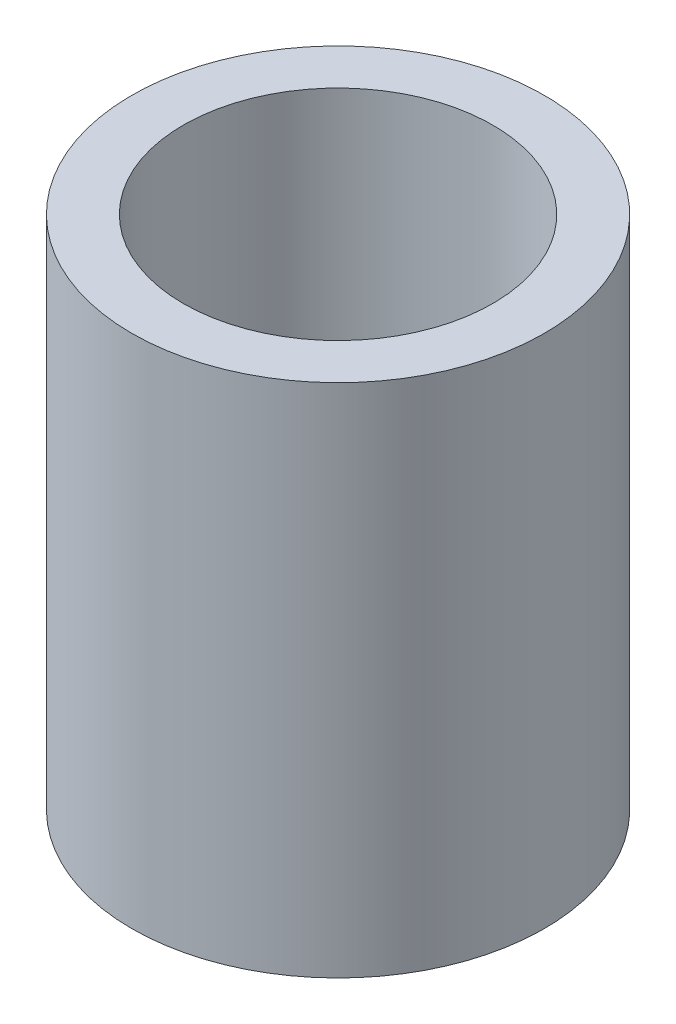
ISO-10303-21;
HEADER;
FILE_DESCRIPTION(('STEP AP214'),'2;1');
FILE_NAME('part.step','',(''),(''),'','','');
FILE_SCHEMA(('AUTOMOTIVE_DESIGN { 1 0 10303 214 1 1 1 1 }'));
ENDSEC;
DATA;
#1=APPLICATION_CONTEXT('core data for automotive mechanical design processes');
#2=APPLICATION_PROTOCOL_DEFINITION('international standard','automotive_design',2000,#1);
#3=PRODUCT_CONTEXT('',#1,'mechanical');
#4=PRODUCT('Part','Part','',(#3));
#5=PRODUCT_RELATED_PRODUCT_CATEGORY('part','',(#4));
#6=PRODUCT_DEFINITION_FORMATION('','',#4);
#7=PRODUCT_DEFINITION_CONTEXT('part definition',#1,'design');
#8=PRODUCT_DEFINITION('design','',#6,#7);
#9=PRODUCT_DEFINITION_SHAPE('','',#8);
#10=(LENGTH_UNIT() NAMED_UNIT(*) SI_UNIT(.MILLI.,.METRE.));
#11=(NAMED_UNIT(*) PLANE_ANGLE_UNIT() SI_UNIT($,.RADIAN.));
#12=(NAMED_UNIT(*) SI_UNIT($,.STERADIAN.) SOLID_ANGLE_UNIT());
#13=UNCERTAINTY_MEASURE_WITH_UNIT(LENGTH_MEASURE(1.E-05),#10,'distance_accuracy_value','');
#14=(GEOMETRIC_REPRESENTATION_CONTEXT(3) GLOBAL_UNCERTAINTY_ASSIGNED_CONTEXT((#13)) GLOBAL_UNIT_ASSIGNED_CONTEXT((#10,
#11,#12)) REPRESENTATION_CONTEXT('',''));
#15=CARTESIAN_POINT('',(0.,0.,0.));
#16=DIRECTION('',(0.,0.,1.));
#17=DIRECTION('',(1.,0.,0.));
#18=AXIS2_PLACEMENT_3D('',#15,#16,#17);
#19=CARTESIAN_POINT('',(0.,25.4,0.));
#20=DIRECTION('',(0.,-1.,0.));
#21=DIRECTION('',(0.,0.,-1.));
#22=AXIS2_PLACEMENT_3D('',#19,#20,#21);
#23=CYLINDRICAL_SURFACE('',#22,10.16);
#24=CARTESIAN_POINT('',(0.,25.4,0.));
#25=DIRECTION('',(0.,1.,0.));
#26=DIRECTION('',(0.,0.,1.));
#27=AXIS2_PLACEMENT_3D('',#24,#25,#26);
#28=CIRCLE('',#27,10.16);
#29=CARTESIAN_POINT('',(0.,25.4,10.16));
#30=VERTEX_POINT('',#29);
#31=EDGE_CURVE('E61',#30,#30,#28,.T.);
#32=ORIENTED_EDGE('',*,*,#31,.F.);
#33=EDGE_LOOP('',(#32));
#34=FACE_BOUND('',#33,.T.);
#35=CARTESIAN_POINT('',(0.,0.,0.));
#36=DIRECTION('',(0.,1.,0.));
#37=DIRECTION('',(0.,0.,1.));
#38=AXIS2_PLACEMENT_3D('',#35,#36,#37);
#39=CIRCLE('',#38,10.16);
#40=CARTESIAN_POINT('',(0.,0.,10.16));
#41=VERTEX_POINT('',#40);
#42=EDGE_CURVE('E62',#41,#41,#39,.T.);
#43=ORIENTED_EDGE('',*,*,#42,.T.);
#44=EDGE_LOOP('',(#43));
#45=FACE_BOUND('',#44,.T.);
#46=ADVANCED_FACE('F40',(#34,#45),#23,.T.);
#47=CARTESIAN_POINT('',(0.,25.4,0.));
#48=DIRECTION('',(0.,1.,0.));
#49=DIRECTION('',(0.,0.,1.));
#50=AXIS2_PLACEMENT_3D('',#47,#48,#49);
#51=PLANE('',#50);
#52=CARTESIAN_POINT('',(0.,25.4,0.));
#53=DIRECTION('',(0.,1.,0.));
#54=DIRECTION('',(0.,0.,1.));
#55=AXIS2_PLACEMENT_3D('',#52,#53,#54);
#56=CIRCLE('',#55,7.62);
#57=CARTESIAN_POINT('',(0.,25.4,7.62));
#58=VERTEX_POINT('',#57);
#59=EDGE_CURVE('E68',#58,#58,#56,.T.);
#60=ORIENTED_EDGE('',*,*,#59,.F.);
#61=EDGE_LOOP('',(#60));
#62=FACE_BOUND('',#61,.T.);
#63=ORIENTED_EDGE('',*,*,#31,.T.);
#64=EDGE_LOOP('',(#63));
#65=FACE_BOUND('',#64,.T.);
#66=ADVANCED_FACE('F83',(#62,#65),#51,.T.);
#67=CARTESIAN_POINT('',(0.,0.,0.));
#68=DIRECTION('',(0.,1.,0.));
#69=DIRECTION('',(0.,0.,1.));
#70=AXIS2_PLACEMENT_3D('',#67,#68,#69);
#71=PLANE('',#70);
#72=CARTESIAN_POINT('',(0.,0.,0.));
#73=DIRECTION('',(0.,1.,0.));
#74=DIRECTION('',(0.,0.,1.));
#75=AXIS2_PLACEMENT_3D('',#72,#73,#74);
#76=CIRCLE('',#75,1.27000000000001);
#77=CARTESIAN_POINT('',(0.,0.,1.27000000000001));
#78=VERTEX_POINT('',#77);
#79=EDGE_CURVE('E52',#78,#78,#76,.T.);
#80=ORIENTED_EDGE('',*,*,#79,.T.);
#81=EDGE_LOOP('',(#80));
#82=FACE_BOUND('',#81,.T.);
#83=ORIENTED_EDGE('',*,*,#42,.F.);
#84=EDGE_LOOP('',(#83));
#85=FACE_BOUND('',#84,.T.);
#86=ADVANCED_FACE('F79',(#82,#85),#71,.F.);
#87=CARTESIAN_POINT('',(0.,5.08,0.));
#88=DIRECTION('',(0.,1.,0.));
#89=DIRECTION('',(0.,0.,1.));
#90=AXIS2_PLACEMENT_3D('',#87,#88,#89);
#91=CYLINDRICAL_SURFACE('',#90,7.62);
#92=CARTESIAN_POINT('',(0.,5.08,0.));
#93=DIRECTION('',(0.,1.,0.));
#94=DIRECTION('',(0.,0.,1.));
#95=AXIS2_PLACEMENT_3D('',#92,#93,#94);
#96=CIRCLE('',#95,7.62);
#97=CARTESIAN_POINT('',(0.,5.08,7.62));
#98=VERTEX_POINT('',#97);
#99=EDGE_CURVE('E65',#98,#98,#96,.T.);
#100=ORIENTED_EDGE('',*,*,#99,.F.);
#101=EDGE_LOOP('',(#100));
#102=FACE_BOUND('',#101,.T.);
#103=ORIENTED_EDGE('',*,*,#59,.T.);
#104=EDGE_LOOP('',(#103));
#105=FACE_BOUND('',#104,.T.);
#106=ADVANCED_FACE('F76',(#102,#105),#91,.F.);
#107=CARTESIAN_POINT('',(0.,5.08,0.));
#108=DIRECTION('',(0.,1.,0.));
#109=DIRECTION('',(0.,0.,1.));
#110=AXIS2_PLACEMENT_3D('',#107,#108,#109);
#111=PLANE('',#110);
#112=ORIENTED_EDGE('',*,*,#99,.T.);
#113=EDGE_LOOP('',(#112));
#114=FACE_BOUND('',#113,.T.);
#115=ADVANCED_FACE('F74',(#114),#111,.T.);
#116=CARTESIAN_POINT('',(0.,3.048,0.));
#117=DIRECTION('',(0.,-1.,0.));
#118=DIRECTION('',(0.,0.,-1.));
#119=AXIS2_PLACEMENT_3D('',#116,#117,#118);
#120=CYLINDRICAL_SURFACE('',#119,0.889);
#121=CARTESIAN_POINT('',(0.,2.8321,0.));
#122=DIRECTION('',(0.,-1.,0.));
#123=DIRECTION('',(0.,0.,-1.));
#124=AXIS2_PLACEMENT_3D('',#121,#122,#123);
#125=CIRCLE('',#124,0.889);
#126=CARTESIAN_POINT('',(0.,2.8321,-0.889));
#127=VERTEX_POINT('',#126);
#128=EDGE_CURVE('E10',#127,#127,#125,.F.);
#129=CARTESIAN_POINT('',(0.,0.381000000000014,0.));
#130=DIRECTION('',(0.,1.,0.));
#131=DIRECTION('',(0.,0.,1.));
#132=AXIS2_PLACEMENT_3D('',#129,#130,#131);
#133=CIRCLE('',#132,0.889);
#134=CARTESIAN_POINT('',(0.,0.381000000000013,-0.889));
#135=VERTEX_POINT('',#134);
#136=EDGE_CURVE('E56',#135,#135,#133,.F.);
#137=CARTESIAN_POINT('',(0.,2.8321,-0.889));
#138=CARTESIAN_POINT('',(0.,2.80656770833334,-0.889));
#139=CARTESIAN_POINT('',(0.,2.78103541666667,-0.889));
#140=CARTESIAN_POINT('',(0.,2.72997083333334,-0.889));
#141=CARTESIAN_POINT('',(0.,2.70443854166667,-0.889));
#142=CARTESIAN_POINT('',(0.,2.65337395833334,-0.889));
#143=CARTESIAN_POINT('',(0.,2.62784166666667,-0.889));
#144=CARTESIAN_POINT('',(0.,2.57677708333334,-0.889));
#145=CARTESIAN_POINT('',(0.,2.55124479166667,-0.889));
#146=CARTESIAN_POINT('',(0.,2.50018020833334,-0.889));
#147=CARTESIAN_POINT('',(0.,2.47464791666667,-0.889));
#148=CARTESIAN_POINT('',(0.,2.42358333333334,-0.889));
#149=CARTESIAN_POINT('',(0.,2.39805104166667,-0.889));
#150=CARTESIAN_POINT('',(0.,2.34698645833334,-0.889));
#151=CARTESIAN_POINT('',(0.,2.32145416666667,-0.889));
#152=CARTESIAN_POINT('',(0.,2.27038958333334,-0.889));
#153=CARTESIAN_POINT('',(0.,2.24485729166667,-0.889));
#154=CARTESIAN_POINT('',(0.,2.19379270833334,-0.889));
#155=CARTESIAN_POINT('',(0.,2.16826041666667,-0.889));
#156=CARTESIAN_POINT('',(0.,2.11719583333334,-0.889));
#157=CARTESIAN_POINT('',(0.,2.09166354166667,-0.889));
#158=CARTESIAN_POINT('',(0.,2.04059895833334,-0.889));
#159=CARTESIAN_POINT('',(0.,2.01506666666667,-0.889));
#160=CARTESIAN_POINT('',(0.,1.96400208333334,-0.889));
#161=CARTESIAN_POINT('',(0.,1.93846979166667,-0.889));
#162=CARTESIAN_POINT('',(0.,1.88740520833334,-0.889));
#163=CARTESIAN_POINT('',(0.,1.86187291666667,-0.889));
#164=CARTESIAN_POINT('',(0.,1.81080833333334,-0.889));
#165=CARTESIAN_POINT('',(0.,1.78527604166667,-0.889));
#166=CARTESIAN_POINT('',(0.,1.73421145833334,-0.889));
#167=CARTESIAN_POINT('',(0.,1.70867916666667,-0.889));
#168=CARTESIAN_POINT('',(0.,1.65761458333334,-0.889));
#169=CARTESIAN_POINT('',(0.,1.63208229166667,-0.889));
#170=CARTESIAN_POINT('',(0.,1.58101770833334,-0.889));
#171=CARTESIAN_POINT('',(0.,1.55548541666667,-0.889));
#172=CARTESIAN_POINT('',(0.,1.50442083333334,-0.889));
#173=CARTESIAN_POINT('',(0.,1.47888854166667,-0.889));
#174=CARTESIAN_POINT('',(0.,1.42782395833334,-0.889));
#175=CARTESIAN_POINT('',(0.,1.40229166666667,-0.889));
#176=CARTESIAN_POINT('',(0.,1.35122708333334,-0.889));
#177=CARTESIAN_POINT('',(0.,1.32569479166668,-0.889));
#178=CARTESIAN_POINT('',(0.,1.27463020833334,-0.889));
#179=CARTESIAN_POINT('',(0.,1.24909791666668,-0.889));
#180=CARTESIAN_POINT('',(0.,1.19803333333334,-0.889));
#181=CARTESIAN_POINT('',(0.,1.17250104166668,-0.889));
#182=CARTESIAN_POINT('',(0.,1.12143645833334,-0.889));
#183=CARTESIAN_POINT('',(0.,1.09590416666668,-0.889));
#184=CARTESIAN_POINT('',(0.,1.04483958333334,-0.889));
#185=CARTESIAN_POINT('',(0.,1.01930729166668,-0.889));
#186=CARTESIAN_POINT('',(0.,0.968242708333344,-0.889));
#187=CARTESIAN_POINT('',(0.,0.942710416666677,-0.889));
#188=CARTESIAN_POINT('',(0.,0.891645833333344,-0.889));
#189=CARTESIAN_POINT('',(0.,0.866113541666678,-0.889));
#190=CARTESIAN_POINT('',(0.,0.815048958333345,-0.889));
#191=CARTESIAN_POINT('',(0.,0.789516666666678,-0.889));
#192=CARTESIAN_POINT('',(0.,0.738452083333345,-0.889));
#193=CARTESIAN_POINT('',(0.,0.712919791666679,-0.889));
#194=CARTESIAN_POINT('',(0.,0.661855208333345,-0.889));
#195=CARTESIAN_POINT('',(0.,0.636322916666679,-0.889));
#196=CARTESIAN_POINT('',(0.,0.585258333333345,-0.889));
#197=CARTESIAN_POINT('',(0.,0.559726041666679,-0.889));
#198=CARTESIAN_POINT('',(0.,0.508661458333346,-0.889));
#199=CARTESIAN_POINT('',(0.,0.483129166666679,-0.889));
#200=CARTESIAN_POINT('',(0.,0.432064583333346,-0.889));
#201=CARTESIAN_POINT('',(0.,0.40653229166668,-0.889));
#202=CARTESIAN_POINT('',(0.,0.381000000000013,-0.889));
#203=B_SPLINE_CURVE_WITH_KNOTS('',3,(#137,#138,#139,#140,#141,#142,#143,#144,#145,#146,#147,
#148,#149,#150,#151,#152,#153,#154,#155,#156,#157,#158,#159,#160,#161,#162,#163,#164,#165,#166,
#167,#168,#169,#170,#171,#172,#173,#174,#175,#176,#177,#178,#179,#180,#181,#182,#183,#184,#185,
#186,#187,#188,#189,#190,#191,#192,#193,#194,#195,#196,#197,#198,#199,#200,#201,#202),
.UNSPECIFIED.,.F.,.F.,(4,2,2,2,2,2,2,2,2,2,2,2,2,2,2,2,2,2,2,2,2,2,2,2,2,2,2,2,2,2,2,2,4),(0.,
0.0765968749999999,0.153193749999999,0.229790624999999,0.306387499999999,0.382984374999998,
0.459581249999998,0.536178124999998,0.612774999999997,0.689371874999997,0.765968749999996,
0.842565624999996,0.919162499999996,0.995759374999996,1.07235625,1.14895312499999,
1.22554999999999,1.30214687499999,1.37874374999999,1.45534062499999,1.53193749999999,
1.60853437499999,1.68513124999999,1.76172812499999,1.83832499999999,1.91492187499999,
1.99151874999999,2.06811562499999,2.14471249999999,2.22130937499999,2.29790624999999,
2.37450312499999,2.45109999999999),.UNSPECIFIED.);
#204=EDGE_CURVE('BSEAM111',#127,#135,#203,.T.);
#205=ORIENTED_EDGE('',*,*,#128,.T.);
#206=ORIENTED_EDGE('',*,*,#136,.T.);
#207=ORIENTED_EDGE('',*,*,#204,.T.);
#208=ORIENTED_EDGE('',*,*,#204,.F.);
#209=EDGE_LOOP('',(#205,#207,#206,#208));
#210=FACE_BOUND('',#209,.T.);
#211=ADVANCED_FACE('F111',(#210),#120,.F.);
#212=CARTESIAN_POINT('',(0.,3.048,0.));
#213=DIRECTION('',(0.,-1.,0.));
#214=DIRECTION('',(0.,0.,-1.));
#215=AXIS2_PLACEMENT_3D('',#212,#213,#214);
#216=PLANE('',#215);
#217=CARTESIAN_POINT('',(0.,3.048,0.));
#218=DIRECTION('',(0.,-1.,0.));
#219=DIRECTION('',(0.,0.,-1.));
#220=AXIS2_PLACEMENT_3D('',#217,#218,#219);
#221=CIRCLE('',#220,0.0832502306458635);
#222=CARTESIAN_POINT('',(0.,3.048,-0.0832502306458627));
#223=VERTEX_POINT('',#222);
#224=EDGE_CURVE('E48',#223,#223,#221,.T.);
#225=ORIENTED_EDGE('',*,*,#224,.T.);
#226=EDGE_LOOP('',(#225));
#227=FACE_BOUND('',#226,.T.);
#228=ADVANCED_FACE('F104',(#227),#216,.T.);
#229=CARTESIAN_POINT('',(0.,0.381000000000014,0.));
#230=DIRECTION('',(0.,-1.,0.));
#231=DIRECTION('',(0.,0.,-1.));
#232=AXIS2_PLACEMENT_3D('',#229,#230,#231);
#233=CONICAL_SURFACE('',#232,0.889,0.785398163397449);
#234=ORIENTED_EDGE('',*,*,#79,.F.);
#235=EDGE_LOOP('',(#234));
#236=FACE_BOUND('',#235,.T.);
#237=ORIENTED_EDGE('',*,*,#136,.F.);
#238=EDGE_LOOP('',(#237));
#239=FACE_BOUND('',#238,.T.);
#240=ADVANCED_FACE('F100',(#236,#239),#233,.F.);
#241=CARTESIAN_POINT('',(0.,3.048,0.));
#242=DIRECTION('',(0.,-1.,0.));
#243=DIRECTION('',(0.,0.,-1.));
#244=AXIS2_PLACEMENT_3D('',#241,#242,#243);
#245=CONICAL_SURFACE('',#244,0.0832502306458635,1.30899693899575);
#246=CARTESIAN_POINT('',(0.,2.8321,-0.888999999999999));
#247=CARTESIAN_POINT('',(0.,2.83434895833333,-0.880606773235894));
#248=CARTESIAN_POINT('',(0.,2.83659791666667,-0.872213546471788));
#249=CARTESIAN_POINT('',(0.,2.84109583333333,-0.855427092943577));
#250=CARTESIAN_POINT('',(0.,2.84334479166667,-0.847033866179471));
#251=CARTESIAN_POINT('',(0.,2.84784270833334,-0.83024741265126));
#252=CARTESIAN_POINT('',(0.,2.85009166666667,-0.821854185887154));
#253=CARTESIAN_POINT('',(0.,2.85458958333334,-0.805067732358943));
#254=CARTESIAN_POINT('',(0.,2.85683854166667,-0.796674505594838));
#255=CARTESIAN_POINT('',(0.,2.86133645833333,-0.779888052066627));
#256=CARTESIAN_POINT('',(0.,2.86358541666667,-0.771494825302521));
#257=CARTESIAN_POINT('',(0.,2.86808333333334,-0.75470837177431));
#258=CARTESIAN_POINT('',(0.,2.87033229166667,-0.746315145010204));
#259=CARTESIAN_POINT('',(0.,2.87483020833333,-0.729528691481993));
#260=CARTESIAN_POINT('',(0.,2.87707916666667,-0.721135464717887));
#261=CARTESIAN_POINT('',(0.,2.88157708333333,-0.704349011189676));
#262=CARTESIAN_POINT('',(0.,2.88382604166667,-0.695955784425571));
#263=CARTESIAN_POINT('',(0.,2.88832395833333,-0.67916933089736));
#264=CARTESIAN_POINT('',(0.,2.89057291666667,-0.670776104133254));
#265=CARTESIAN_POINT('',(0.,2.89507083333333,-0.653989650605043));
#266=CARTESIAN_POINT('',(0.,2.89731979166667,-0.645596423840937));
#267=CARTESIAN_POINT('',(0.,2.90181770833333,-0.628809970312726));
#268=CARTESIAN_POINT('',(0.,2.90406666666667,-0.62041674354862));
#269=CARTESIAN_POINT('',(0.,2.90856458333333,-0.603630290020409));
#270=CARTESIAN_POINT('',(0.,2.91081354166667,-0.595237063256304));
#271=CARTESIAN_POINT('',(0.,2.91531145833333,-0.578450609728092));
#272=CARTESIAN_POINT('',(0.,2.91756041666667,-0.570057382963987));
#273=CARTESIAN_POINT('',(0.,2.92205833333333,-0.553270929435776));
#274=CARTESIAN_POINT('',(0.,2.92430729166667,-0.54487770267167));
#275=CARTESIAN_POINT('',(0.,2.92880520833333,-0.528091249143459));
#276=CARTESIAN_POINT('',(0.,2.93105416666667,-0.519698022379353));
#277=CARTESIAN_POINT('',(0.,2.93555208333333,-0.502911568851142));
#278=CARTESIAN_POINT('',(0.,2.93780104166667,-0.494518342087037));
#279=CARTESIAN_POINT('',(0.,2.94229895833333,-0.477731888558825));
#280=CARTESIAN_POINT('',(0.,2.94454791666667,-0.46933866179472));
#281=CARTESIAN_POINT('',(0.,2.94904583333333,-0.452552208266509));
#282=CARTESIAN_POINT('',(0.,2.95129479166667,-0.444158981502403));
#283=CARTESIAN_POINT('',(0.,2.95579270833333,-0.427372527974192));
#284=CARTESIAN_POINT('',(0.,2.95804166666667,-0.418979301210086));
#285=CARTESIAN_POINT('',(0.,2.96253958333333,-0.402192847681875));
#286=CARTESIAN_POINT('',(0.,2.96478854166667,-0.393799620917769));
#287=CARTESIAN_POINT('',(0.,2.96928645833333,-0.377013167389558));
#288=CARTESIAN_POINT('',(0.,2.97153541666667,-0.368619940625453));
#289=CARTESIAN_POINT('',(0.,2.97603333333333,-0.351833487097242));
#290=CARTESIAN_POINT('',(0.,2.97828229166667,-0.343440260333136));
#291=CARTESIAN_POINT('',(0.,2.98278020833333,-0.326653806804925));
#292=CARTESIAN_POINT('',(0.,2.98502916666667,-0.318260580040819));
#293=CARTESIAN_POINT('',(0.,2.98952708333333,-0.301474126512608));
#294=CARTESIAN_POINT('',(0.,2.99177604166667,-0.293080899748502));
#295=CARTESIAN_POINT('',(0.,2.99627395833333,-0.276294446220291));
#296=CARTESIAN_POINT('',(0.,2.99852291666667,-0.267901219456186));
#297=CARTESIAN_POINT('',(0.,3.00302083333333,-0.251114765927974));
#298=CARTESIAN_POINT('',(0.,3.00526979166667,-0.242721539163869));
#299=CARTESIAN_POINT('',(0.,3.00976770833333,-0.225935085635658));
#300=CARTESIAN_POINT('',(0.,3.01201666666667,-0.217541858871552));
#301=CARTESIAN_POINT('',(0.,3.01651458333333,-0.200755405343341));
#302=CARTESIAN_POINT('',(0.,3.01876354166667,-0.192362178579235));
#303=CARTESIAN_POINT('',(0.,3.02326145833333,-0.175575725051024));
#304=CARTESIAN_POINT('',(0.,3.02551041666667,-0.167182498286919));
#305=CARTESIAN_POINT('',(0.,3.03000833333333,-0.150396044758707));
#306=CARTESIAN_POINT('',(0.,3.03225729166667,-0.142002817994602));
#307=CARTESIAN_POINT('',(0.,3.03675520833333,-0.125216364466391));
#308=CARTESIAN_POINT('',(0.,3.03900416666667,-0.116823137702285));
#309=CARTESIAN_POINT('',(0.,3.04350208333333,-0.100036684174074));
#310=CARTESIAN_POINT('',(0.,3.04575104166667,-0.0916434574099683));
#311=CARTESIAN_POINT('',(0.,3.048,-0.0832502306458627));
#312=B_SPLINE_CURVE_WITH_KNOTS('',3,(#246,#247,#248,#249,#250,#251,#252,#253,#254,#255,#256,
#257,#258,#259,#260,#261,#262,#263,#264,#265,#266,#267,#268,#269,#270,#271,#272,#273,#274,#275,
#276,#277,#278,#279,#280,#281,#282,#283,#284,#285,#286,#287,#288,#289,#290,#291,#292,#293,#294,
#295,#296,#297,#298,#299,#300,#301,#302,#303,#304,#305,#306,#307,#308,#309,#310,#311),
.UNSPECIFIED.,.F.,.F.,(4,2,2,2,2,2,2,2,2,2,2,2,2,2,2,2,2,2,2,2,2,2,2,2,2,2,2,2,2,2,2,2,4),(0.,
0.0260679232369767,0.0521358464739536,0.0782037697109302,0.104271692947907,0.130339616184883,
0.15640753942186,0.182475462658837,0.208543385895814,0.23461130913279,0.260679232369767,
0.286747155606744,0.312815078843721,0.338883002080697,0.364950925317674,0.391018848554651,
0.417086771791627,0.443154695028604,0.469222618265581,0.495290541502557,0.521358464739534,
0.547426387976511,0.573494311213487,0.599562234450464,0.625630157687441,0.651698080924417,
0.677766004161394,0.703833927398371,0.729901850635347,0.755969773872324,0.782037697109301,
0.808105620346278,0.834173543583254),.UNSPECIFIED.);
#313=EDGE_CURVE('BSEAM43',#127,#223,#312,.T.);
#314=ORIENTED_EDGE('',*,*,#128,.F.);
#315=ORIENTED_EDGE('',*,*,#224,.F.);
#316=ORIENTED_EDGE('',*,*,#313,.T.);
#317=ORIENTED_EDGE('',*,*,#313,.F.);
#318=EDGE_LOOP('',(#314,#316,#315,#317));
#319=FACE_BOUND('',#318,.T.);
#320=ADVANCED_FACE('F43',(#319),#245,.F.);
#321=CLOSED_SHELL('',(#46,#66,#86,#106,#115,#211,#228,#240,#320));
#322=MANIFOLD_SOLID_BREP('B2',#321);
#323=ADVANCED_BREP_SHAPE_REPRESENTATION('',(#18,#322),#14);
#324=SHAPE_DEFINITION_REPRESENTATION(#9,#323);
ENDSEC;
END-ISO-10303-21;
